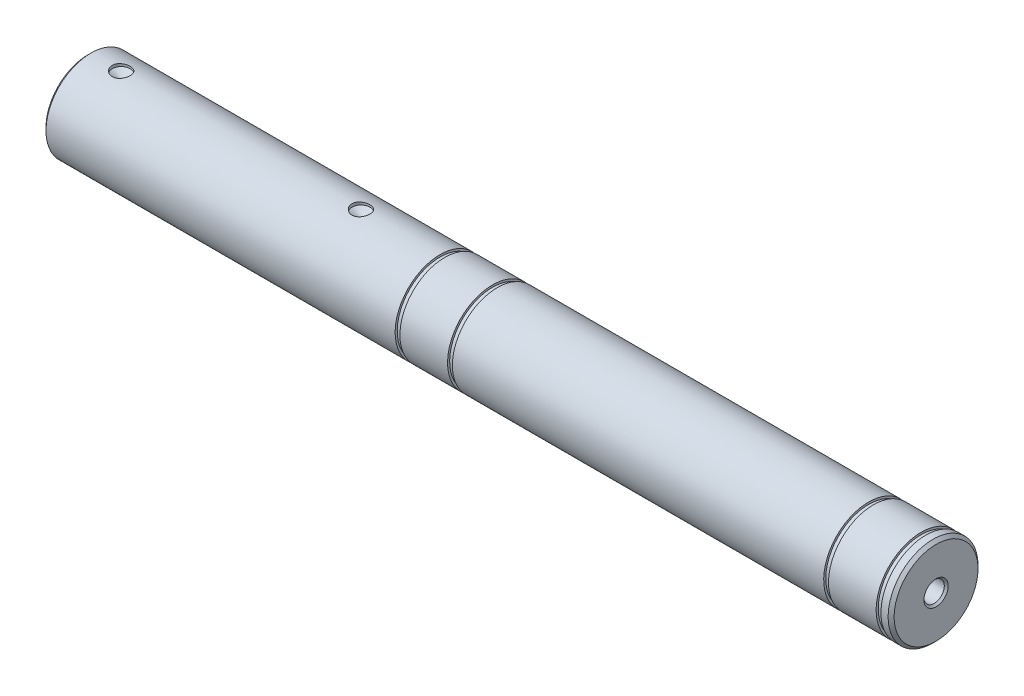
ISO-10303-21;
HEADER;
FILE_DESCRIPTION(('STEP AP214'),'2;1');
FILE_NAME('part.step','',(''),(''),'','','');
FILE_SCHEMA(('AUTOMOTIVE_DESIGN { 1 0 10303 214 1 1 1 1 }'));
ENDSEC;
DATA;
#1=APPLICATION_CONTEXT('core data for automotive mechanical design processes');
#2=APPLICATION_PROTOCOL_DEFINITION('international standard','automotive_design',2000,#1);
#3=PRODUCT_CONTEXT('',#1,'mechanical');
#4=PRODUCT('Part','Part','',(#3));
#5=PRODUCT_RELATED_PRODUCT_CATEGORY('part','',(#4));
#6=PRODUCT_DEFINITION_FORMATION('','',#4);
#7=PRODUCT_DEFINITION_CONTEXT('part definition',#1,'design');
#8=PRODUCT_DEFINITION('design','',#6,#7);
#9=PRODUCT_DEFINITION_SHAPE('','',#8);
#10=(LENGTH_UNIT() NAMED_UNIT(*) SI_UNIT(.MILLI.,.METRE.));
#11=(NAMED_UNIT(*) PLANE_ANGLE_UNIT() SI_UNIT($,.RADIAN.));
#12=(NAMED_UNIT(*) SI_UNIT($,.STERADIAN.) SOLID_ANGLE_UNIT());
#13=UNCERTAINTY_MEASURE_WITH_UNIT(LENGTH_MEASURE(1.E-05),#10,'distance_accuracy_value','');
#14=(GEOMETRIC_REPRESENTATION_CONTEXT(3) GLOBAL_UNCERTAINTY_ASSIGNED_CONTEXT((#13)) GLOBAL_UNIT_ASSIGNED_CONTEXT((#10,
#11,#12)) REPRESENTATION_CONTEXT('',''));
#15=CARTESIAN_POINT('',(0.,0.,0.));
#16=DIRECTION('',(0.,0.,1.));
#17=DIRECTION('',(1.,0.,0.));
#18=AXIS2_PLACEMENT_3D('',#15,#16,#17);
#19=CARTESIAN_POINT('',(-141.5,14.,0.));
#20=DIRECTION('',(1.,0.,0.));
#21=DIRECTION('',(0.,1.,0.));
#22=AXIS2_PLACEMENT_3D('',#19,#20,#21);
#23=PLANE('',#22);
#24=CARTESIAN_POINT('',(-141.5,0.,0.));
#25=DIRECTION('',(-1.,0.,0.));
#26=DIRECTION('',(0.,0.,1.));
#27=AXIS2_PLACEMENT_3D('',#24,#25,#26);
#28=CIRCLE('',#27,4.05000000000011);
#29=CARTESIAN_POINT('',(-141.5,0.,4.05000000000011));
#30=VERTEX_POINT('',#29);
#31=EDGE_CURVE('E86',#30,#30,#28,.T.);
#32=ORIENTED_EDGE('',*,*,#31,.F.);
#33=EDGE_LOOP('',(#32));
#34=FACE_BOUND('',#33,.T.);
#35=CARTESIAN_POINT('',(-141.5,0.,0.));
#36=DIRECTION('',(-1.,0.,0.));
#37=DIRECTION('',(0.,-1.,0.));
#38=AXIS2_PLACEMENT_3D('',#35,#36,#37);
#39=CIRCLE('',#38,14.);
#40=CARTESIAN_POINT('',(-141.5,-14.,0.));
#41=VERTEX_POINT('',#40);
#42=EDGE_CURVE('E152',#41,#41,#39,.T.);
#43=ORIENTED_EDGE('',*,*,#42,.T.);
#44=EDGE_LOOP('',(#43));
#45=FACE_BOUND('',#44,.T.);
#46=ADVANCED_FACE('F39',(#34,#45),#23,.F.);
#47=CARTESIAN_POINT('',(-140.5,0.,0.));
#48=DIRECTION('',(1.,0.,0.));
#49=DIRECTION('',(0.,1.,0.));
#50=AXIS2_PLACEMENT_3D('',#47,#48,#49);
#51=CONICAL_SURFACE('',#50,15.,0.785398163397447);
#52=ORIENTED_EDGE('',*,*,#42,.F.);
#53=EDGE_LOOP('',(#52));
#54=FACE_BOUND('',#53,.T.);
#55=CARTESIAN_POINT('',(-140.5,0.,0.));
#56=DIRECTION('',(-1.,0.,0.));
#57=DIRECTION('',(0.,-1.,0.));
#58=AXIS2_PLACEMENT_3D('',#55,#56,#57);
#59=CIRCLE('',#58,15.);
#60=CARTESIAN_POINT('',(-140.5,-15.,0.));
#61=VERTEX_POINT('',#60);
#62=EDGE_CURVE('E149',#61,#61,#59,.T.);
#63=ORIENTED_EDGE('',*,*,#62,.T.);
#64=EDGE_LOOP('',(#63));
#65=FACE_BOUND('',#64,.T.);
#66=ADVANCED_FACE('F265',(#54,#65),#51,.T.);
#67=CARTESIAN_POINT('',(-241.855208517557,0.,0.));
#68=DIRECTION('',(-1.,0.,0.));
#69=DIRECTION('',(0.,-1.,0.));
#70=AXIS2_PLACEMENT_3D('',#67,#68,#69);
#71=CYLINDRICAL_SURFACE('',#70,15.);
#72=CARTESIAN_POINT('',(-130.4,14.6969384566991,3.00000000000002));
#73=CARTESIAN_POINT('',(-130.566693126473,14.6969417707994,2.99999383762583));
#74=CARTESIAN_POINT('',(-130.73346387,14.6998052480611,2.98605951515445));
#75=CARTESIAN_POINT('',(-131.062287515429,14.7109329391462,2.93073685074854));
#76=CARTESIAN_POINT('',(-131.224336533908,14.7192014743436,2.8893265412115));
#77=CARTESIAN_POINT('',(-131.538911910063,14.7401662116556,2.78038734785926));
#78=CARTESIAN_POINT('',(-131.691447564598,14.7528580086323,2.71288444245789));
#79=CARTESIAN_POINT('',(-131.983024534091,14.7812339844197,2.55374732301154));
#80=CARTESIAN_POINT('',(-132.122066601614,14.7969179962038,2.46211445580348));
#81=CARTESIAN_POINT('',(-132.384683011561,14.8297589908276,2.25593722696034));
#82=CARTESIAN_POINT('',(-132.508038763652,14.8469321351174,2.14111696773999));
#83=CARTESIAN_POINT('',(-132.733872600737,14.8806741690779,1.89242036706397));
#84=CARTESIAN_POINT('',(-132.836349222252,14.8972430163249,1.75854269093399));
#85=CARTESIAN_POINT('',(-133.018364052885,14.9280838925269,1.4740840677728));
#86=CARTESIAN_POINT('',(-133.09769454145,14.9423346432465,1.32336770301666));
#87=CARTESIAN_POINT('',(-133.229824811144,14.9667521065089,1.01041245116184));
#88=CARTESIAN_POINT('',(-133.282627075703,14.9769192013236,0.848174644261688));
#89=CARTESIAN_POINT('',(-133.359521580859,14.9919096206526,0.51905031983551));
#90=CARTESIAN_POINT('',(-133.383982932713,14.9968015886438,0.352253217644468));
#91=CARTESIAN_POINT('',(-133.404652855515,15.0009276355081,0.0168557053126346));
#92=CARTESIAN_POINT('',(-133.400864148937,15.0001622595828,-0.151744529495503));
#93=CARTESIAN_POINT('',(-133.365421459353,14.9931130460555,-0.483426002230737));
#94=CARTESIAN_POINT('',(-133.334165068496,14.9869079509751,-0.64655164289538));
#95=CARTESIAN_POINT('',(-133.245304902623,14.9697653147823,-0.965194879740875));
#96=CARTESIAN_POINT('',(-133.187700073424,14.9588275843212,-1.12071217124136));
#97=CARTESIAN_POINT('',(-133.047409879558,14.9333188805988,-1.42085838960263));
#98=CARTESIAN_POINT('',(-132.964568746685,14.9187254452567,-1.56541252240167));
#99=CARTESIAN_POINT('',(-132.77627276829,14.8875140842136,-1.83871513757924));
#100=CARTESIAN_POINT('',(-132.670815320688,14.8708959256567,-1.96746179857498));
#101=CARTESIAN_POINT('',(-132.438099133675,14.8371289309338,-2.20785429316035));
#102=CARTESIAN_POINT('',(-132.310492439811,14.8199758937255,-2.31916294972087));
#103=CARTESIAN_POINT('',(-132.038250672648,14.7873471479628,-2.5188554795304));
#104=CARTESIAN_POINT('',(-131.89361527735,14.7718714711364,-2.60723891918323));
#105=CARTESIAN_POINT('',(-131.590937504535,14.7443414241877,-2.75868844440563));
#106=CARTESIAN_POINT('',(-131.432867097081,14.7322944469065,-2.82169994333311));
#107=CARTESIAN_POINT('',(-131.108086028828,14.7130942896382,-2.92017102488273));
#108=CARTESIAN_POINT('',(-130.941376497143,14.7059404718528,-2.95563419836991));
#109=CARTESIAN_POINT('',(-130.607105426003,14.6974643780348,-2.99749801810814));
#110=CARTESIAN_POINT('',(-130.439607277069,14.6960444117146,-3.00438557669372));
#111=CARTESIAN_POINT('',(-130.105855330401,14.6989345706656,-2.9902128849322));
#112=CARTESIAN_POINT('',(-129.939601462643,14.7032443710116,-2.96915421936732));
#113=CARTESIAN_POINT('',(-129.614694079123,14.7170169748474,-2.90010662422246));
#114=CARTESIAN_POINT('',(-129.455982970893,14.7264299704349,-2.85237786251789));
#115=CARTESIAN_POINT('',(-129.148810162914,14.7493046805499,-2.73162310592554));
#116=CARTESIAN_POINT('',(-129.000349308693,14.7627667285881,-2.65859502711952));
#117=CARTESIAN_POINT('',(-128.715760670149,14.7924421788612,-2.48821242664678));
#118=CARTESIAN_POINT('',(-128.579818861097,14.8086891559471,-2.39055323394826));
#119=CARTESIAN_POINT('',(-128.326075063997,14.8420117147991,-2.17408671663813));
#120=CARTESIAN_POINT('',(-128.208274945252,14.8590873817145,-2.05527721543361));
#121=CARTESIAN_POINT('',(-127.992312322443,14.8924603760765,-1.79769682049366));
#122=CARTESIAN_POINT('',(-127.89447903605,14.9087417312605,-1.65864749678887));
#123=CARTESIAN_POINT('',(-127.723562355501,14.9384138288586,-1.36580368990424));
#124=CARTESIAN_POINT('',(-127.650477921966,14.9518046926563,-1.2120098263005));
#125=CARTESIAN_POINT('',(-127.53161338476,14.974118821832,-0.894908042472019));
#126=CARTESIAN_POINT('',(-127.485678445321,14.9830673742781,-0.731660020434217));
#127=CARTESIAN_POINT('',(-127.421926257008,14.9955970781298,-0.399568364039721));
#128=CARTESIAN_POINT('',(-127.404105621573,14.9991788759955,-0.230725406133623));
#129=CARTESIAN_POINT('',(-127.397219057111,15.0005562136234,0.104618681710875));
#130=CARTESIAN_POINT('',(-127.407658158631,14.9984513564799,0.271109436424494));
#131=CARTESIAN_POINT('',(-127.455901851643,14.9889013068102,0.59991309394696));
#132=CARTESIAN_POINT('',(-127.493706099044,14.9814561814329,0.762226049261175));
#133=CARTESIAN_POINT('',(-127.595386976275,14.9620649509476,1.07775824923521));
#134=CARTESIAN_POINT('',(-127.659204134393,14.9501291174284,1.23099732972051));
#135=CARTESIAN_POINT('',(-127.811036723993,14.9230416637104,1.52466366055822));
#136=CARTESIAN_POINT('',(-127.899054067713,14.9078897894096,1.66508989730354));
#137=CARTESIAN_POINT('',(-128.098458161184,14.8757279747022,1.93159167031775));
#138=CARTESIAN_POINT('',(-128.210199009151,14.858692002537,2.05739914834454));
#139=CARTESIAN_POINT('',(-128.453150720296,14.8248366872359,2.28864785327554));
#140=CARTESIAN_POINT('',(-128.58436618844,14.8080173963616,2.39408424962676));
#141=CARTESIAN_POINT('',(-128.864237950071,14.7763002820179,2.58267665834996));
#142=CARTESIAN_POINT('',(-129.013066883364,14.7614251071368,2.66558044385429));
#143=CARTESIAN_POINT('',(-129.32279831978,14.7355571137924,2.8050721477987));
#144=CARTESIAN_POINT('',(-129.483689716062,14.7245607757495,2.86168393792251));
#145=CARTESIAN_POINT('',(-129.770787366329,14.7098904341353,2.93600741957298));
#146=CARTESIAN_POINT('',(-129.895356258542,14.7050635474382,2.95996169557107));
#147=CARTESIAN_POINT('',(-130.146601863653,14.6985863537725,2.99196005387915));
#148=CARTESIAN_POINT('',(-130.273278503733,14.6969359372925,3.00000468468795));
#149=CARTESIAN_POINT('',(-130.4,14.6969384566991,3.00000000000002));
#150=B_SPLINE_CURVE_WITH_KNOTS('',3,(#72,#73,#74,#75,#76,#77,#78,#79,#80,#81,#82,#83,#84,#85,
#86,#87,#88,#89,#90,#91,#92,#93,#94,#95,#96,#97,#98,#99,#100,#101,#102,#103,#104,#105,#106,#107,
#108,#109,#110,#111,#112,#113,#114,#115,#116,#117,#118,#119,#120,#121,#122,#123,#124,#125,#126,
#127,#128,#129,#130,#131,#132,#133,#134,#135,#136,#137,#138,#139,#140,#141,#142,#143,#144,#145,
#146,#147,#148,#149),.UNSPECIFIED.,.T.,.F.,(4,2,2,2,2,2,2,2,2,2,2,2,2,2,2,2,2,2,2,2,2,2,2,2,2,2,
2,2,2,2,2,2,2,2,2,2,2,2,4),(0.,0.499615391608269,0.999630717852883,1.49914949382174,
1.99864039457956,2.50446757645307,3.01033020106264,3.52060201312348,4.03082604739679,
4.5343274664924,5.03778036348744,5.53406368900611,6.0303668722125,6.52979772666907,
7.02928607310198,7.5374804028745,8.04568434368159,8.55497589518327,9.06420105048072,
9.56471273413778,10.0651960358526,10.5608802534996,11.056605310632,11.5587917932356,
12.0610299861063,12.5709780520035,13.0809046989032,13.5878944073595,14.0948230407488,
14.5929305224406,15.0910317410027,15.5880005122636,16.0850085640405,16.5900345607679,
17.0951801666934,17.6057669573883,18.1158892527059,18.4957141091448,18.8755258705644),.UNSPECIFIED.);
#151=CARTESIAN_POINT('',(-130.4,14.6969384566991,3.00000000000002));
#152=VERTEX_POINT('',#151);
#153=EDGE_CURVE('E11',#152,#152,#150,.T.);
#154=ORIENTED_EDGE('',*,*,#153,.T.);
#155=EDGE_LOOP('',(#154));
#156=FACE_BOUND('',#155,.T.);
#157=CARTESIAN_POINT('',(-50.4,14.6969384566991,3.00000000000001));
#158=CARTESIAN_POINT('',(-50.5666931264734,14.6969417707994,2.99999383762582));
#159=CARTESIAN_POINT('',(-50.73346387,14.6998052480611,2.98605951515444));
#160=CARTESIAN_POINT('',(-51.0622875154294,14.7109329391462,2.93073685074853));
#161=CARTESIAN_POINT('',(-51.2243365339079,14.7192014743436,2.88932654121149));
#162=CARTESIAN_POINT('',(-51.5389119100626,14.7401662116556,2.78038734785924));
#163=CARTESIAN_POINT('',(-51.6914475645977,14.7528580086323,2.71288444245787));
#164=CARTESIAN_POINT('',(-51.9830245340908,14.7812339844198,2.55374732301152));
#165=CARTESIAN_POINT('',(-52.1220666016137,14.7969179962038,2.46211445580346));
#166=CARTESIAN_POINT('',(-52.3846830115615,14.8297589908276,2.25593722696032));
#167=CARTESIAN_POINT('',(-52.5080387636519,14.8469321351174,2.14111696773996));
#168=CARTESIAN_POINT('',(-52.7338726007369,14.880674169078,1.89242036706394));
#169=CARTESIAN_POINT('',(-52.8363492222515,14.8972430163249,1.75854269093396));
#170=CARTESIAN_POINT('',(-53.0183640528853,14.9280838925269,1.47408406777278));
#171=CARTESIAN_POINT('',(-53.0976945414499,14.9423346432465,1.32336770301664));
#172=CARTESIAN_POINT('',(-53.2298248111444,14.9667521065089,1.01041245116182));
#173=CARTESIAN_POINT('',(-53.2826270757029,14.9769192013236,0.848174644261665));
#174=CARTESIAN_POINT('',(-53.3595215808588,14.9919096206526,0.519050319835487));
#175=CARTESIAN_POINT('',(-53.383982932713,14.9968015886438,0.352253217644447));
#176=CARTESIAN_POINT('',(-53.4046528555149,15.0009276355081,0.016855705312614));
#177=CARTESIAN_POINT('',(-53.4008641489374,15.0001622595828,-0.151744529495524));
#178=CARTESIAN_POINT('',(-53.3654214593533,14.9931130460555,-0.48342600223076));
#179=CARTESIAN_POINT('',(-53.3341650684964,14.9869079509751,-0.646551642895405));
#180=CARTESIAN_POINT('',(-53.2453049026233,14.9697653147823,-0.965194879740898));
#181=CARTESIAN_POINT('',(-53.1877000734243,14.9588275843212,-1.12071217124138));
#182=CARTESIAN_POINT('',(-53.0474098795582,14.9333188805988,-1.42085838960266));
#183=CARTESIAN_POINT('',(-52.9645687466853,14.9187254452567,-1.56541252240169));
#184=CARTESIAN_POINT('',(-52.7762727682902,14.8875140842136,-1.83871513757926));
#185=CARTESIAN_POINT('',(-52.6708153206884,14.8708959256567,-1.967461798575));
#186=CARTESIAN_POINT('',(-52.4380991336745,14.8371289309338,-2.20785429316037));
#187=CARTESIAN_POINT('',(-52.3104924398112,14.8199758937255,-2.31916294972089));
#188=CARTESIAN_POINT('',(-52.0382506726477,14.7873471479628,-2.51885547953042));
#189=CARTESIAN_POINT('',(-51.8936152773504,14.7718714711364,-2.60723891918325));
#190=CARTESIAN_POINT('',(-51.5909375045345,14.7443414241877,-2.75868844440564));
#191=CARTESIAN_POINT('',(-51.432867097081,14.7322944469065,-2.82169994333313));
#192=CARTESIAN_POINT('',(-51.108086028828,14.7130942896382,-2.92017102488274));
#193=CARTESIAN_POINT('',(-50.9413764971427,14.7059404718528,-2.95563419836992));
#194=CARTESIAN_POINT('',(-50.6071054260028,14.6974643780348,-2.99749801810815));
#195=CARTESIAN_POINT('',(-50.4396072770689,14.6960444117146,-3.00438557669373));
#196=CARTESIAN_POINT('',(-50.1058553304009,14.6989345706656,-2.99021288493221));
#197=CARTESIAN_POINT('',(-49.9396014626434,14.7032443710116,-2.96915421936732));
#198=CARTESIAN_POINT('',(-49.6146940791233,14.7170169748474,-2.90010662422247));
#199=CARTESIAN_POINT('',(-49.4559829708927,14.7264299704349,-2.85237786251789));
#200=CARTESIAN_POINT('',(-49.1488101629137,14.7493046805499,-2.73162310592555));
#201=CARTESIAN_POINT('',(-49.0003493086928,14.7627667285881,-2.65859502711953));
#202=CARTESIAN_POINT('',(-48.7157606701495,14.7924421788612,-2.48821242664679));
#203=CARTESIAN_POINT('',(-48.5798188610975,14.8086891559471,-2.39055323394826));
#204=CARTESIAN_POINT('',(-48.3260750639972,14.8420117147991,-2.17408671663813));
#205=CARTESIAN_POINT('',(-48.2082749452522,14.8590873817145,-2.05527721543361));
#206=CARTESIAN_POINT('',(-47.9923123224432,14.8924603760765,-1.79769682049367));
#207=CARTESIAN_POINT('',(-47.89447903605,14.9087417312605,-1.65864749678888));
#208=CARTESIAN_POINT('',(-47.7235623555012,14.9384138288586,-1.36580368990426));
#209=CARTESIAN_POINT('',(-47.6504779219656,14.9518046926563,-1.21200982630051));
#210=CARTESIAN_POINT('',(-47.5316133847601,14.974118821832,-0.894908042472031));
#211=CARTESIAN_POINT('',(-47.4856784453212,14.9830673742781,-0.731660020434228));
#212=CARTESIAN_POINT('',(-47.4219262570084,14.9955970781298,-0.399568364039729));
#213=CARTESIAN_POINT('',(-47.4041056215729,14.9991788759955,-0.230725406133629));
#214=CARTESIAN_POINT('',(-47.3972190571113,15.0005562136234,0.10461868171087));
#215=CARTESIAN_POINT('',(-47.4076581586313,14.9984513564799,0.271109436424488));
#216=CARTESIAN_POINT('',(-47.4559018516434,14.9889013068102,0.599913093946957));
#217=CARTESIAN_POINT('',(-47.4937060990443,14.9814561814329,0.762226049261175));
#218=CARTESIAN_POINT('',(-47.5953869762747,14.9620649509476,1.0777582492352));
#219=CARTESIAN_POINT('',(-47.6592041343929,14.9501291174284,1.2309973297205));
#220=CARTESIAN_POINT('',(-47.8110367239933,14.9230416637104,1.52466366055821));
#221=CARTESIAN_POINT('',(-47.8990540677135,14.9078897894096,1.66508989730354));
#222=CARTESIAN_POINT('',(-48.0984581611838,14.8757279747022,1.93159167031776));
#223=CARTESIAN_POINT('',(-48.2101990091513,14.858692002537,2.05739914834454));
#224=CARTESIAN_POINT('',(-48.4531507202963,14.8248366872359,2.28864785327553));
#225=CARTESIAN_POINT('',(-48.5843661884397,14.8080173963616,2.39408424962675));
#226=CARTESIAN_POINT('',(-48.8642379500712,14.7763002820179,2.58267665834995));
#227=CARTESIAN_POINT('',(-49.0130668833637,14.7614251071368,2.66558044385428));
#228=CARTESIAN_POINT('',(-49.3227983197803,14.7355571137924,2.80507214779869));
#229=CARTESIAN_POINT('',(-49.4836897160615,14.7245607757495,2.8616839379225));
#230=CARTESIAN_POINT('',(-49.7707873663286,14.7098904341354,2.93600741957298));
#231=CARTESIAN_POINT('',(-49.8953562585418,14.7050635474382,2.95996169557106));
#232=CARTESIAN_POINT('',(-50.1466018636534,14.6985863537725,2.99196005387914));
#233=CARTESIAN_POINT('',(-50.2732785037334,14.6969359372925,3.00000468468794));
#234=CARTESIAN_POINT('',(-50.4,14.6969384566991,3.00000000000001));
#235=B_SPLINE_CURVE_WITH_KNOTS('',3,(#157,#158,#159,#160,#161,#162,#163,#164,#165,#166,#167,
#168,#169,#170,#171,#172,#173,#174,#175,#176,#177,#178,#179,#180,#181,#182,#183,#184,#185,#186,
#187,#188,#189,#190,#191,#192,#193,#194,#195,#196,#197,#198,#199,#200,#201,#202,#203,#204,#205,
#206,#207,#208,#209,#210,#211,#212,#213,#214,#215,#216,#217,#218,#219,#220,#221,#222,#223,#224,
#225,#226,#227,#228,#229,#230,#231,#232,#233,#234),.UNSPECIFIED.,.T.,.F.,(4,2,2,2,2,2,2,2,2,2,2,
2,2,2,2,2,2,2,2,2,2,2,2,2,2,2,2,2,2,2,2,2,2,2,2,2,2,2,4),(0.,0.499615391608283,
0.999630717852891,1.49914949382176,1.99864039457959,2.5044675764531,3.01033020106266,
3.52060201312351,4.0308260473968,4.53432746649242,5.03778036348745,5.53406368900613,
6.03036687221251,6.5297977266691,7.02928607310199,7.53748040287451,8.04568434368162,
8.55497589518331,9.06420105048075,9.56471273413781,10.0651960358526,10.5608802534996,
11.056605310632,11.5587917932356,12.0610299861063,12.5709780520035,13.0809046989032,
13.5878944073595,14.0948230407488,14.5929305224406,15.0910317410027,15.5880005122636,
16.0850085640405,16.5900345607679,17.0951801666935,17.6057669573882,18.115889252706,
18.4957141091449,18.8755258705644),.UNSPECIFIED.);
#236=CARTESIAN_POINT('',(-50.4,14.6969384566991,3.00000000000001));
#237=VERTEX_POINT('',#236);
#238=EDGE_CURVE('E50',#237,#237,#235,.T.);
#239=ORIENTED_EDGE('',*,*,#238,.T.);
#240=EDGE_LOOP('',(#239));
#241=FACE_BOUND('',#240,.T.);
#242=ORIENTED_EDGE('',*,*,#62,.F.);
#243=EDGE_LOOP('',(#242));
#244=FACE_BOUND('',#243,.T.);
#245=CARTESIAN_POINT('',(-24.,0.,0.));
#246=DIRECTION('',(-1.,0.,0.));
#247=DIRECTION('',(0.,-1.,0.));
#248=AXIS2_PLACEMENT_3D('',#245,#246,#247);
#249=CIRCLE('',#248,15.);
#250=CARTESIAN_POINT('',(-24.,-15.,0.));
#251=VERTEX_POINT('',#250);
#252=EDGE_CURVE('E146',#251,#251,#249,.T.);
#253=ORIENTED_EDGE('',*,*,#252,.T.);
#254=EDGE_LOOP('',(#253));
#255=FACE_BOUND('',#254,.T.);
#256=ADVANCED_FACE('F158',(#156,#241,#244,#255),#71,.T.);
#257=CARTESIAN_POINT('',(-24.,15.,0.));
#258=DIRECTION('',(-1.,0.,0.));
#259=DIRECTION('',(0.,-1.,0.));
#260=AXIS2_PLACEMENT_3D('',#257,#258,#259);
#261=PLANE('',#260);
#262=ORIENTED_EDGE('',*,*,#252,.F.);
#263=EDGE_LOOP('',(#262));
#264=FACE_BOUND('',#263,.T.);
#265=CARTESIAN_POINT('',(-24.,0.,0.));
#266=DIRECTION('',(-1.,0.,0.));
#267=DIRECTION('',(0.,-1.,0.));
#268=AXIS2_PLACEMENT_3D('',#265,#266,#267);
#269=CIRCLE('',#268,14.3);
#270=CARTESIAN_POINT('',(-24.,-14.3,0.));
#271=VERTEX_POINT('',#270);
#272=EDGE_CURVE('E143',#271,#271,#269,.T.);
#273=ORIENTED_EDGE('',*,*,#272,.T.);
#274=EDGE_LOOP('',(#273));
#275=FACE_BOUND('',#274,.T.);
#276=ADVANCED_FACE('F258',(#264,#275),#261,.F.);
#277=CARTESIAN_POINT('',(-241.855208517557,0.,0.));
#278=DIRECTION('',(-1.,0.,0.));
#279=DIRECTION('',(0.,-1.,0.));
#280=AXIS2_PLACEMENT_3D('',#277,#278,#279);
#281=CYLINDRICAL_SURFACE('',#280,14.3);
#282=ORIENTED_EDGE('',*,*,#272,.F.);
#283=EDGE_LOOP('',(#282));
#284=FACE_BOUND('',#283,.T.);
#285=CARTESIAN_POINT('',(-22.4,0.,0.));
#286=DIRECTION('',(-1.,0.,0.));
#287=DIRECTION('',(0.,-1.,0.));
#288=AXIS2_PLACEMENT_3D('',#285,#286,#287);
#289=CIRCLE('',#288,14.3);
#290=CARTESIAN_POINT('',(-22.4,-14.3,0.));
#291=VERTEX_POINT('',#290);
#292=EDGE_CURVE('E140',#291,#291,#289,.T.);
#293=ORIENTED_EDGE('',*,*,#292,.T.);
#294=EDGE_LOOP('',(#293));
#295=FACE_BOUND('',#294,.T.);
#296=ADVANCED_FACE('F255',(#284,#295),#281,.T.);
#297=CARTESIAN_POINT('',(-22.4,14.3,0.));
#298=DIRECTION('',(1.,0.,0.));
#299=DIRECTION('',(0.,1.,0.));
#300=AXIS2_PLACEMENT_3D('',#297,#298,#299);
#301=PLANE('',#300);
#302=ORIENTED_EDGE('',*,*,#292,.F.);
#303=EDGE_LOOP('',(#302));
#304=FACE_BOUND('',#303,.T.);
#305=CARTESIAN_POINT('',(-22.4,0.,0.));
#306=DIRECTION('',(-1.,0.,0.));
#307=DIRECTION('',(0.,-1.,0.));
#308=AXIS2_PLACEMENT_3D('',#305,#306,#307);
#309=CIRCLE('',#308,15.);
#310=CARTESIAN_POINT('',(-22.4,-15.,0.));
#311=VERTEX_POINT('',#310);
#312=EDGE_CURVE('E137',#311,#311,#309,.T.);
#313=ORIENTED_EDGE('',*,*,#312,.T.);
#314=EDGE_LOOP('',(#313));
#315=FACE_BOUND('',#314,.T.);
#316=ADVANCED_FACE('F251',(#304,#315),#301,.F.);
#317=CARTESIAN_POINT('',(-241.855208517557,0.,0.));
#318=DIRECTION('',(-1.,0.,0.));
#319=DIRECTION('',(0.,-1.,0.));
#320=AXIS2_PLACEMENT_3D('',#317,#318,#319);
#321=CYLINDRICAL_SURFACE('',#320,15.);
#322=ORIENTED_EDGE('',*,*,#312,.F.);
#323=EDGE_LOOP('',(#322));
#324=FACE_BOUND('',#323,.T.);
#325=CARTESIAN_POINT('',(-6.50000000000001,0.,0.));
#326=DIRECTION('',(-1.,0.,0.));
#327=DIRECTION('',(0.,-1.,0.));
#328=AXIS2_PLACEMENT_3D('',#325,#326,#327);
#329=CIRCLE('',#328,15.);
#330=CARTESIAN_POINT('',(-6.50000000000001,-15.,0.));
#331=VERTEX_POINT('',#330);
#332=EDGE_CURVE('E134',#331,#331,#329,.T.);
#333=ORIENTED_EDGE('',*,*,#332,.T.);
#334=EDGE_LOOP('',(#333));
#335=FACE_BOUND('',#334,.T.);
#336=ADVANCED_FACE('F247',(#324,#335),#321,.T.);
#337=CARTESIAN_POINT('',(-6.49999999999999,15.,0.));
#338=DIRECTION('',(-1.,0.,0.));
#339=DIRECTION('',(0.,-1.,0.));
#340=AXIS2_PLACEMENT_3D('',#337,#338,#339);
#341=PLANE('',#340);
#342=ORIENTED_EDGE('',*,*,#332,.F.);
#343=EDGE_LOOP('',(#342));
#344=FACE_BOUND('',#343,.T.);
#345=CARTESIAN_POINT('',(-6.50000000000001,0.,0.));
#346=DIRECTION('',(-1.,0.,0.));
#347=DIRECTION('',(0.,-1.,0.));
#348=AXIS2_PLACEMENT_3D('',#345,#346,#347);
#349=CIRCLE('',#348,14.3);
#350=CARTESIAN_POINT('',(-6.50000000000001,-14.3,0.));
#351=VERTEX_POINT('',#350);
#352=EDGE_CURVE('E131',#351,#351,#349,.T.);
#353=ORIENTED_EDGE('',*,*,#352,.T.);
#354=EDGE_LOOP('',(#353));
#355=FACE_BOUND('',#354,.T.);
#356=ADVANCED_FACE('F243',(#344,#355),#341,.F.);
#357=CARTESIAN_POINT('',(-241.855208517557,0.,0.));
#358=DIRECTION('',(-1.,0.,0.));
#359=DIRECTION('',(0.,-1.,0.));
#360=AXIS2_PLACEMENT_3D('',#357,#358,#359);
#361=CYLINDRICAL_SURFACE('',#360,14.3);
#362=ORIENTED_EDGE('',*,*,#352,.F.);
#363=EDGE_LOOP('',(#362));
#364=FACE_BOUND('',#363,.T.);
#365=CARTESIAN_POINT('',(-4.90000000000002,0.,0.));
#366=DIRECTION('',(-1.,0.,0.));
#367=DIRECTION('',(0.,-1.,0.));
#368=AXIS2_PLACEMENT_3D('',#365,#366,#367);
#369=CIRCLE('',#368,14.3);
#370=CARTESIAN_POINT('',(-4.90000000000002,-14.3,0.));
#371=VERTEX_POINT('',#370);
#372=EDGE_CURVE('E128',#371,#371,#369,.T.);
#373=ORIENTED_EDGE('',*,*,#372,.T.);
#374=EDGE_LOOP('',(#373));
#375=FACE_BOUND('',#374,.T.);
#376=ADVANCED_FACE('F239',(#364,#375),#361,.T.);
#377=CARTESIAN_POINT('',(-4.9,14.3,0.));
#378=DIRECTION('',(1.,0.,0.));
#379=DIRECTION('',(0.,1.,0.));
#380=AXIS2_PLACEMENT_3D('',#377,#378,#379);
#381=PLANE('',#380);
#382=ORIENTED_EDGE('',*,*,#372,.F.);
#383=EDGE_LOOP('',(#382));
#384=FACE_BOUND('',#383,.T.);
#385=CARTESIAN_POINT('',(-4.90000000000002,0.,0.));
#386=DIRECTION('',(-1.,0.,0.));
#387=DIRECTION('',(0.,-1.,0.));
#388=AXIS2_PLACEMENT_3D('',#385,#386,#387);
#389=CIRCLE('',#388,15.);
#390=CARTESIAN_POINT('',(-4.90000000000002,-15.,0.));
#391=VERTEX_POINT('',#390);
#392=EDGE_CURVE('E125',#391,#391,#389,.T.);
#393=ORIENTED_EDGE('',*,*,#392,.T.);
#394=EDGE_LOOP('',(#393));
#395=FACE_BOUND('',#394,.T.);
#396=ADVANCED_FACE('F235',(#384,#395),#381,.F.);
#397=CARTESIAN_POINT('',(-241.855208517557,0.,0.));
#398=DIRECTION('',(-1.,0.,0.));
#399=DIRECTION('',(0.,-1.,0.));
#400=AXIS2_PLACEMENT_3D('',#397,#398,#399);
#401=CYLINDRICAL_SURFACE('',#400,15.);
#402=ORIENTED_EDGE('',*,*,#392,.F.);
#403=EDGE_LOOP('',(#402));
#404=FACE_BOUND('',#403,.T.);
#405=CARTESIAN_POINT('',(119.,0.,0.));
#406=DIRECTION('',(-1.,0.,0.));
#407=DIRECTION('',(0.,-1.,0.));
#408=AXIS2_PLACEMENT_3D('',#405,#406,#407);
#409=CIRCLE('',#408,15.);
#410=CARTESIAN_POINT('',(119.,-15.,0.));
#411=VERTEX_POINT('',#410);
#412=EDGE_CURVE('E122',#411,#411,#409,.T.);
#413=ORIENTED_EDGE('',*,*,#412,.T.);
#414=EDGE_LOOP('',(#413));
#415=FACE_BOUND('',#414,.T.);
#416=ADVANCED_FACE('F231',(#404,#415),#401,.T.);
#417=CARTESIAN_POINT('',(119.,15.,0.));
#418=DIRECTION('',(-1.,0.,0.));
#419=DIRECTION('',(0.,-1.,0.));
#420=AXIS2_PLACEMENT_3D('',#417,#418,#419);
#421=PLANE('',#420);
#422=ORIENTED_EDGE('',*,*,#412,.F.);
#423=EDGE_LOOP('',(#422));
#424=FACE_BOUND('',#423,.T.);
#425=CARTESIAN_POINT('',(119.,0.,0.));
#426=DIRECTION('',(-1.,0.,0.));
#427=DIRECTION('',(0.,-1.,0.));
#428=AXIS2_PLACEMENT_3D('',#425,#426,#427);
#429=CIRCLE('',#428,14.3);
#430=CARTESIAN_POINT('',(119.,-14.3,0.));
#431=VERTEX_POINT('',#430);
#432=EDGE_CURVE('E119',#431,#431,#429,.T.);
#433=ORIENTED_EDGE('',*,*,#432,.T.);
#434=EDGE_LOOP('',(#433));
#435=FACE_BOUND('',#434,.T.);
#436=ADVANCED_FACE('F227',(#424,#435),#421,.F.);
#437=CARTESIAN_POINT('',(-241.855208517557,0.,0.));
#438=DIRECTION('',(-1.,0.,0.));
#439=DIRECTION('',(0.,-1.,0.));
#440=AXIS2_PLACEMENT_3D('',#437,#438,#439);
#441=CYLINDRICAL_SURFACE('',#440,14.3);
#442=ORIENTED_EDGE('',*,*,#432,.F.);
#443=EDGE_LOOP('',(#442));
#444=FACE_BOUND('',#443,.T.);
#445=CARTESIAN_POINT('',(120.6,0.,0.));
#446=DIRECTION('',(-1.,0.,0.));
#447=DIRECTION('',(0.,-1.,0.));
#448=AXIS2_PLACEMENT_3D('',#445,#446,#447);
#449=CIRCLE('',#448,14.3);
#450=CARTESIAN_POINT('',(120.6,-14.3,0.));
#451=VERTEX_POINT('',#450);
#452=EDGE_CURVE('E116',#451,#451,#449,.T.);
#453=ORIENTED_EDGE('',*,*,#452,.T.);
#454=EDGE_LOOP('',(#453));
#455=FACE_BOUND('',#454,.T.);
#456=ADVANCED_FACE('F223',(#444,#455),#441,.T.);
#457=CARTESIAN_POINT('',(120.6,14.3,0.));
#458=DIRECTION('',(1.,0.,0.));
#459=DIRECTION('',(0.,1.,0.));
#460=AXIS2_PLACEMENT_3D('',#457,#458,#459);
#461=PLANE('',#460);
#462=ORIENTED_EDGE('',*,*,#452,.F.);
#463=EDGE_LOOP('',(#462));
#464=FACE_BOUND('',#463,.T.);
#465=CARTESIAN_POINT('',(120.6,0.,0.));
#466=DIRECTION('',(-1.,0.,0.));
#467=DIRECTION('',(0.,-1.,0.));
#468=AXIS2_PLACEMENT_3D('',#465,#466,#467);
#469=CIRCLE('',#468,15.);
#470=CARTESIAN_POINT('',(120.6,-15.,0.));
#471=VERTEX_POINT('',#470);
#472=EDGE_CURVE('E113',#471,#471,#469,.T.);
#473=ORIENTED_EDGE('',*,*,#472,.T.);
#474=EDGE_LOOP('',(#473));
#475=FACE_BOUND('',#474,.T.);
#476=ADVANCED_FACE('F219',(#464,#475),#461,.F.);
#477=CARTESIAN_POINT('',(-241.855208517557,0.,0.));
#478=DIRECTION('',(-1.,0.,0.));
#479=DIRECTION('',(0.,-1.,0.));
#480=AXIS2_PLACEMENT_3D('',#477,#478,#479);
#481=CYLINDRICAL_SURFACE('',#480,15.);
#482=ORIENTED_EDGE('',*,*,#472,.F.);
#483=EDGE_LOOP('',(#482));
#484=FACE_BOUND('',#483,.T.);
#485=CARTESIAN_POINT('',(136.5,0.,0.));
#486=DIRECTION('',(-1.,0.,0.));
#487=DIRECTION('',(0.,-1.,0.));
#488=AXIS2_PLACEMENT_3D('',#485,#486,#487);
#489=CIRCLE('',#488,15.);
#490=CARTESIAN_POINT('',(136.5,-15.,0.));
#491=VERTEX_POINT('',#490);
#492=EDGE_CURVE('E110',#491,#491,#489,.T.);
#493=ORIENTED_EDGE('',*,*,#492,.T.);
#494=EDGE_LOOP('',(#493));
#495=FACE_BOUND('',#494,.T.);
#496=ADVANCED_FACE('F215',(#484,#495),#481,.T.);
#497=CARTESIAN_POINT('',(136.5,15.,0.));
#498=DIRECTION('',(-1.,0.,0.));
#499=DIRECTION('',(0.,-1.,0.));
#500=AXIS2_PLACEMENT_3D('',#497,#498,#499);
#501=PLANE('',#500);
#502=ORIENTED_EDGE('',*,*,#492,.F.);
#503=EDGE_LOOP('',(#502));
#504=FACE_BOUND('',#503,.T.);
#505=CARTESIAN_POINT('',(136.5,0.,0.));
#506=DIRECTION('',(-1.,0.,0.));
#507=DIRECTION('',(0.,-1.,0.));
#508=AXIS2_PLACEMENT_3D('',#505,#506,#507);
#509=CIRCLE('',#508,14.3);
#510=CARTESIAN_POINT('',(136.5,-14.3,0.));
#511=VERTEX_POINT('',#510);
#512=EDGE_CURVE('E107',#511,#511,#509,.T.);
#513=ORIENTED_EDGE('',*,*,#512,.T.);
#514=EDGE_LOOP('',(#513));
#515=FACE_BOUND('',#514,.T.);
#516=ADVANCED_FACE('F211',(#504,#515),#501,.F.);
#517=CARTESIAN_POINT('',(-241.855208517557,0.,0.));
#518=DIRECTION('',(-1.,0.,0.));
#519=DIRECTION('',(0.,-1.,0.));
#520=AXIS2_PLACEMENT_3D('',#517,#518,#519);
#521=CYLINDRICAL_SURFACE('',#520,14.3);
#522=ORIENTED_EDGE('',*,*,#512,.F.);
#523=EDGE_LOOP('',(#522));
#524=FACE_BOUND('',#523,.T.);
#525=CARTESIAN_POINT('',(138.1,0.,0.));
#526=DIRECTION('',(-1.,0.,0.));
#527=DIRECTION('',(0.,-1.,0.));
#528=AXIS2_PLACEMENT_3D('',#525,#526,#527);
#529=CIRCLE('',#528,14.3);
#530=CARTESIAN_POINT('',(138.1,-14.3,0.));
#531=VERTEX_POINT('',#530);
#532=EDGE_CURVE('E104',#531,#531,#529,.T.);
#533=ORIENTED_EDGE('',*,*,#532,.T.);
#534=EDGE_LOOP('',(#533));
#535=FACE_BOUND('',#534,.T.);
#536=ADVANCED_FACE('F207',(#524,#535),#521,.T.);
#537=CARTESIAN_POINT('',(138.1,15.,0.));
#538=DIRECTION('',(1.,0.,0.));
#539=DIRECTION('',(0.,1.,0.));
#540=AXIS2_PLACEMENT_3D('',#537,#538,#539);
#541=PLANE('',#540);
#542=ORIENTED_EDGE('',*,*,#532,.F.);
#543=EDGE_LOOP('',(#542));
#544=FACE_BOUND('',#543,.T.);
#545=CARTESIAN_POINT('',(138.1,0.,0.));
#546=DIRECTION('',(-1.,0.,0.));
#547=DIRECTION('',(0.,-1.,0.));
#548=AXIS2_PLACEMENT_3D('',#545,#546,#547);
#549=CIRCLE('',#548,15.);
#550=CARTESIAN_POINT('',(138.1,-15.,0.));
#551=VERTEX_POINT('',#550);
#552=EDGE_CURVE('E101',#551,#551,#549,.T.);
#553=ORIENTED_EDGE('',*,*,#552,.T.);
#554=EDGE_LOOP('',(#553));
#555=FACE_BOUND('',#554,.T.);
#556=ADVANCED_FACE('F203',(#544,#555),#541,.F.);
#557=CARTESIAN_POINT('',(-241.855208517557,0.,0.));
#558=DIRECTION('',(-1.,0.,0.));
#559=DIRECTION('',(0.,-1.,0.));
#560=AXIS2_PLACEMENT_3D('',#557,#558,#559);
#561=CYLINDRICAL_SURFACE('',#560,15.);
#562=ORIENTED_EDGE('',*,*,#552,.F.);
#563=EDGE_LOOP('',(#562));
#564=FACE_BOUND('',#563,.T.);
#565=CARTESIAN_POINT('',(140.5,0.,0.));
#566=DIRECTION('',(-1.,0.,0.));
#567=DIRECTION('',(0.,-1.,0.));
#568=AXIS2_PLACEMENT_3D('',#565,#566,#567);
#569=CIRCLE('',#568,15.);
#570=CARTESIAN_POINT('',(140.5,-15.,0.));
#571=VERTEX_POINT('',#570);
#572=EDGE_CURVE('E98',#571,#571,#569,.T.);
#573=ORIENTED_EDGE('',*,*,#572,.T.);
#574=EDGE_LOOP('',(#573));
#575=FACE_BOUND('',#574,.T.);
#576=ADVANCED_FACE('F199',(#564,#575),#561,.T.);
#577=CARTESIAN_POINT('',(141.5,0.,0.));
#578=DIRECTION('',(-1.,0.,0.));
#579=DIRECTION('',(0.,-1.,0.));
#580=AXIS2_PLACEMENT_3D('',#577,#578,#579);
#581=CONICAL_SURFACE('',#580,14.,0.785398163397447);
#582=ORIENTED_EDGE('',*,*,#572,.F.);
#583=EDGE_LOOP('',(#582));
#584=FACE_BOUND('',#583,.T.);
#585=CARTESIAN_POINT('',(141.5,0.,0.));
#586=DIRECTION('',(-1.,0.,0.));
#587=DIRECTION('',(0.,-1.,0.));
#588=AXIS2_PLACEMENT_3D('',#585,#586,#587);
#589=CIRCLE('',#588,14.);
#590=CARTESIAN_POINT('',(141.5,-14.,0.));
#591=VERTEX_POINT('',#590);
#592=EDGE_CURVE('E95',#591,#591,#589,.T.);
#593=ORIENTED_EDGE('',*,*,#592,.T.);
#594=EDGE_LOOP('',(#593));
#595=FACE_BOUND('',#594,.T.);
#596=ADVANCED_FACE('F195',(#584,#595),#581,.T.);
#597=CARTESIAN_POINT('',(141.5,14.,0.));
#598=DIRECTION('',(-1.,0.,0.));
#599=DIRECTION('',(0.,-1.,0.));
#600=AXIS2_PLACEMENT_3D('',#597,#598,#599);
#601=PLANE('',#600);
#602=CARTESIAN_POINT('',(141.5,0.,0.));
#603=DIRECTION('',(1.,0.,0.));
#604=DIRECTION('',(0.,0.,-1.));
#605=AXIS2_PLACEMENT_3D('',#602,#603,#604);
#606=CIRCLE('',#605,4.05);
#607=CARTESIAN_POINT('',(141.5,0.,-4.05));
#608=VERTEX_POINT('',#607);
#609=EDGE_CURVE('E75',#608,#608,#606,.T.);
#610=ORIENTED_EDGE('',*,*,#609,.F.);
#611=EDGE_LOOP('',(#610));
#612=FACE_BOUND('',#611,.T.);
#613=ORIENTED_EDGE('',*,*,#592,.F.);
#614=EDGE_LOOP('',(#613));
#615=FACE_BOUND('',#614,.T.);
#616=ADVANCED_FACE('F192',(#612,#615),#601,.F.);
#617=CARTESIAN_POINT('',(-115.25,0.,0.));
#618=DIRECTION('',(-1.,0.,0.));
#619=DIRECTION('',(0.,0.,1.));
#620=AXIS2_PLACEMENT_3D('',#617,#618,#619);
#621=CONICAL_SURFACE('',#620,3.39999999999999,1.02974425867665);
#622=CARTESIAN_POINT('',(-113.207073895306,0.,0.));
#623=VERTEX_POINT('',#622);
#624=VERTEX_LOOP('',#623);
#625=FACE_BOUND('',#624,.T.);
#626=CARTESIAN_POINT('',(-115.25,0.,0.));
#627=DIRECTION('',(-1.,0.,0.));
#628=DIRECTION('',(0.,0.,1.));
#629=AXIS2_PLACEMENT_3D('',#626,#627,#628);
#630=CIRCLE('',#629,3.39999999999999);
#631=CARTESIAN_POINT('',(-115.25,0.,3.39999999999999));
#632=VERTEX_POINT('',#631);
#633=EDGE_CURVE('E92',#632,#632,#630,.T.);
#634=ORIENTED_EDGE('',*,*,#633,.T.);
#635=EDGE_LOOP('',(#634));
#636=FACE_BOUND('',#635,.T.);
#637=ADVANCED_FACE('F188',(#625,#636),#621,.F.);
#638=CARTESIAN_POINT('',(-141.5,0.,0.));
#639=DIRECTION('',(-1.,0.,0.));
#640=DIRECTION('',(0.,0.,1.));
#641=AXIS2_PLACEMENT_3D('',#638,#639,#640);
#642=CYLINDRICAL_SURFACE('',#641,3.39999999999999);
#643=ORIENTED_EDGE('',*,*,#633,.F.);
#644=EDGE_LOOP('',(#643));
#645=FACE_BOUND('',#644,.T.);
#646=CARTESIAN_POINT('',(-140.85,0.,0.));
#647=DIRECTION('',(-1.,0.,0.));
#648=DIRECTION('',(0.,0.,1.));
#649=AXIS2_PLACEMENT_3D('',#646,#647,#648);
#650=CIRCLE('',#649,3.39999999999999);
#651=CARTESIAN_POINT('',(-140.85,0.,3.39999999999999));
#652=VERTEX_POINT('',#651);
#653=EDGE_CURVE('E89',#652,#652,#650,.T.);
#654=ORIENTED_EDGE('',*,*,#653,.T.);
#655=EDGE_LOOP('',(#654));
#656=FACE_BOUND('',#655,.T.);
#657=ADVANCED_FACE('F184',(#645,#656),#642,.F.);
#658=CARTESIAN_POINT('',(-141.5,0.,0.));
#659=DIRECTION('',(-1.,0.,0.));
#660=DIRECTION('',(0.,0.,1.));
#661=AXIS2_PLACEMENT_3D('',#658,#659,#660);
#662=CONICAL_SURFACE('',#661,4.05000000000011,0.785398163397421);
#663=ORIENTED_EDGE('',*,*,#653,.F.);
#664=EDGE_LOOP('',(#663));
#665=FACE_BOUND('',#664,.T.);
#666=ORIENTED_EDGE('',*,*,#31,.T.);
#667=EDGE_LOOP('',(#666));
#668=FACE_BOUND('',#667,.T.);
#669=ADVANCED_FACE('F181',(#665,#668),#662,.F.);
#670=CARTESIAN_POINT('',(115.25,0.,0.));
#671=DIRECTION('',(1.,0.,0.));
#672=DIRECTION('',(0.,0.,-1.));
#673=AXIS2_PLACEMENT_3D('',#670,#671,#672);
#674=CONICAL_SURFACE('',#673,3.39999999999999,1.02974425867665);
#675=CARTESIAN_POINT('',(113.207073895306,0.,0.));
#676=VERTEX_POINT('',#675);
#677=VERTEX_LOOP('',#676);
#678=FACE_BOUND('',#677,.T.);
#679=CARTESIAN_POINT('',(115.25,0.,0.));
#680=DIRECTION('',(1.,0.,0.));
#681=DIRECTION('',(0.,0.,-1.));
#682=AXIS2_PLACEMENT_3D('',#679,#680,#681);
#683=CIRCLE('',#682,3.39999999999999);
#684=CARTESIAN_POINT('',(115.25,0.,-3.39999999999999));
#685=VERTEX_POINT('',#684);
#686=EDGE_CURVE('E83',#685,#685,#683,.T.);
#687=ORIENTED_EDGE('',*,*,#686,.T.);
#688=EDGE_LOOP('',(#687));
#689=FACE_BOUND('',#688,.T.);
#690=ADVANCED_FACE('F177',(#678,#689),#674,.F.);
#691=CARTESIAN_POINT('',(141.5,0.,0.));
#692=DIRECTION('',(1.,0.,0.));
#693=DIRECTION('',(0.,0.,-1.));
#694=AXIS2_PLACEMENT_3D('',#691,#692,#693);
#695=CYLINDRICAL_SURFACE('',#694,3.39999999999999);
#696=ORIENTED_EDGE('',*,*,#686,.F.);
#697=EDGE_LOOP('',(#696));
#698=FACE_BOUND('',#697,.T.);
#699=CARTESIAN_POINT('',(140.85,0.,0.));
#700=DIRECTION('',(1.,0.,0.));
#701=DIRECTION('',(0.,0.,-1.));
#702=AXIS2_PLACEMENT_3D('',#699,#700,#701);
#703=CIRCLE('',#702,3.39999999999999);
#704=CARTESIAN_POINT('',(140.85,0.,-3.39999999999999));
#705=VERTEX_POINT('',#704);
#706=EDGE_CURVE('E80',#705,#705,#703,.T.);
#707=ORIENTED_EDGE('',*,*,#706,.T.);
#708=EDGE_LOOP('',(#707));
#709=FACE_BOUND('',#708,.T.);
#710=ADVANCED_FACE('F173',(#698,#709),#695,.F.);
#711=CARTESIAN_POINT('',(141.5,0.,0.));
#712=DIRECTION('',(1.,0.,0.));
#713=DIRECTION('',(0.,0.,-1.));
#714=AXIS2_PLACEMENT_3D('',#711,#712,#713);
#715=CONICAL_SURFACE('',#714,4.05,0.785398163397448);
#716=ORIENTED_EDGE('',*,*,#706,.F.);
#717=EDGE_LOOP('',(#716));
#718=FACE_BOUND('',#717,.T.);
#719=ORIENTED_EDGE('',*,*,#609,.T.);
#720=EDGE_LOOP('',(#719));
#721=FACE_BOUND('',#720,.T.);
#722=ADVANCED_FACE('F166',(#718,#721),#715,.F.);
#723=CARTESIAN_POINT('',(-50.4,15.,0.));
#724=DIRECTION('',(0.,1.,0.));
#725=DIRECTION('',(0.,0.,1.));
#726=AXIS2_PLACEMENT_3D('',#723,#724,#725);
#727=CYLINDRICAL_SURFACE('',#726,3.);
#728=CARTESIAN_POINT('',(-50.4,14.,0.));
#729=DIRECTION('',(0.,1.,0.));
#730=DIRECTION('',(0.,0.,1.));
#731=AXIS2_PLACEMENT_3D('',#728,#729,#730);
#732=CIRCLE('',#731,3.);
#733=CARTESIAN_POINT('',(-50.4,14.,3.00000000000001));
#734=VERTEX_POINT('',#733);
#735=EDGE_CURVE('E72',#734,#734,#732,.T.);
#736=ORIENTED_EDGE('',*,*,#735,.F.);
#737=EDGE_LOOP('',(#736));
#738=FACE_BOUND('',#737,.T.);
#739=ORIENTED_EDGE('',*,*,#238,.F.);
#740=EDGE_LOOP('',(#739));
#741=FACE_BOUND('',#740,.T.);
#742=ADVANCED_FACE('F161',(#738,#741),#727,.F.);
#743=CARTESIAN_POINT('',(-50.4,14.,0.));
#744=DIRECTION('',(0.,1.,0.));
#745=DIRECTION('',(0.,0.,1.));
#746=AXIS2_PLACEMENT_3D('',#743,#744,#745);
#747=CONICAL_SURFACE('',#746,3.,1.02974425867666);
#748=CARTESIAN_POINT('',(-50.4,12.1974181429173,0.));
#749=VERTEX_POINT('',#748);
#750=VERTEX_LOOP('',#749);
#751=FACE_BOUND('',#750,.T.);
#752=ORIENTED_EDGE('',*,*,#735,.T.);
#753=EDGE_LOOP('',(#752));
#754=FACE_BOUND('',#753,.T.);
#755=ADVANCED_FACE('F165',(#751,#754),#747,.F.);
#756=CARTESIAN_POINT('',(-130.4,15.,0.));
#757=DIRECTION('',(0.,1.,0.));
#758=DIRECTION('',(0.,0.,1.));
#759=AXIS2_PLACEMENT_3D('',#756,#757,#758);
#760=CYLINDRICAL_SURFACE('',#759,3.);
#761=CARTESIAN_POINT('',(-130.4,14.,0.));
#762=DIRECTION('',(0.,1.,0.));
#763=DIRECTION('',(0.,0.,1.));
#764=AXIS2_PLACEMENT_3D('',#761,#762,#763);
#765=CIRCLE('',#764,3.);
#766=CARTESIAN_POINT('',(-130.4,14.,3.00000000000002));
#767=VERTEX_POINT('',#766);
#768=EDGE_CURVE('E70',#767,#767,#765,.T.);
#769=ORIENTED_EDGE('',*,*,#768,.F.);
#770=EDGE_LOOP('',(#769));
#771=FACE_BOUND('',#770,.T.);
#772=ORIENTED_EDGE('',*,*,#153,.F.);
#773=EDGE_LOOP('',(#772));
#774=FACE_BOUND('',#773,.T.);
#775=ADVANCED_FACE('F66',(#771,#774),#760,.F.);
#776=CARTESIAN_POINT('',(-130.4,14.,0.));
#777=DIRECTION('',(0.,1.,0.));
#778=DIRECTION('',(0.,0.,1.));
#779=AXIS2_PLACEMENT_3D('',#776,#777,#778);
#780=CONICAL_SURFACE('',#779,3.,1.02974425867666);
#781=CARTESIAN_POINT('',(-130.4,12.1974181429173,0.));
#782=VERTEX_POINT('',#781);
#783=VERTEX_LOOP('',#782);
#784=FACE_BOUND('',#783,.T.);
#785=ORIENTED_EDGE('',*,*,#768,.T.);
#786=EDGE_LOOP('',(#785));
#787=FACE_BOUND('',#786,.T.);
#788=ADVANCED_FACE('F63',(#784,#787),#780,.F.);
#789=CLOSED_SHELL('',(#46,#66,#256,#276,#296,#316,#336,#356,#376,#396,#416,#436,#456,#476,#496,
#516,#536,#556,#576,#596,#616,#637,#657,#669,#690,#710,#722,#742,#755,#775,#788));
#790=MANIFOLD_SOLID_BREP('B2',#789);
#791=ADVANCED_BREP_SHAPE_REPRESENTATION('',(#18,#790),#14);
#792=SHAPE_DEFINITION_REPRESENTATION(#9,#791);
ENDSEC;
END-ISO-10303-21;
